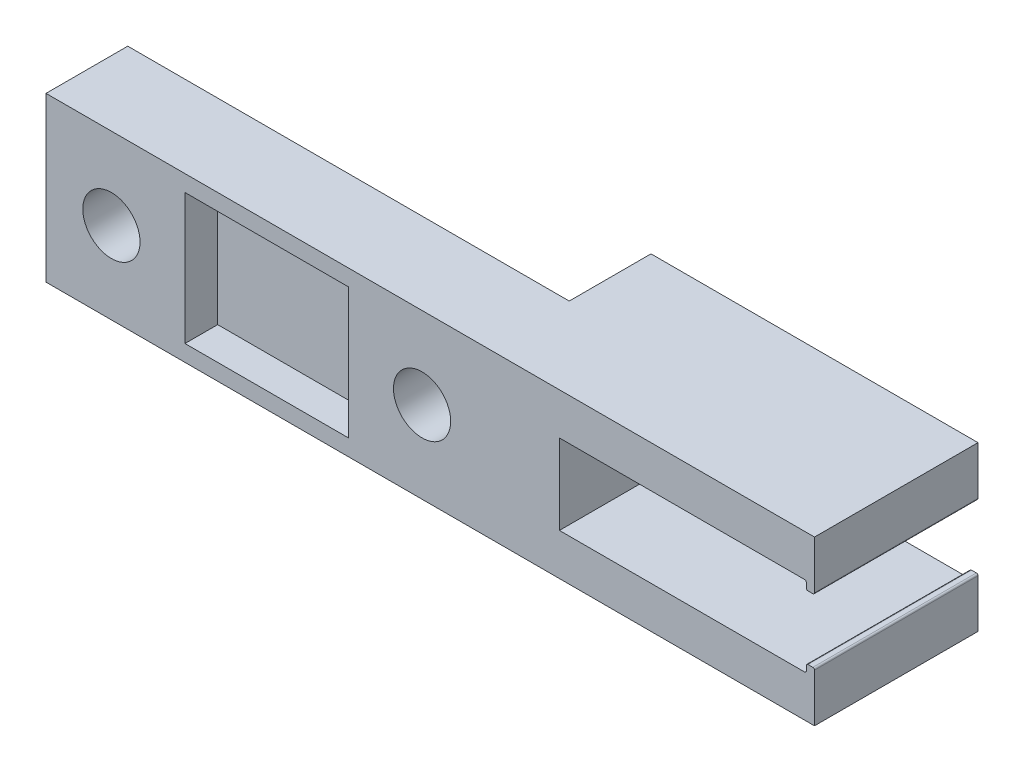
ISO-10303-21;
HEADER;
FILE_DESCRIPTION(('STEP AP214'),'2;1');
FILE_NAME('part.step','',(''),(''),'','','');
FILE_SCHEMA(('AUTOMOTIVE_DESIGN { 1 0 10303 214 1 1 1 1 }'));
ENDSEC;
DATA;
#1=APPLICATION_CONTEXT('core data for automotive mechanical design processes');
#2=APPLICATION_PROTOCOL_DEFINITION('international standard','automotive_design',2000,#1);
#3=PRODUCT_CONTEXT('',#1,'mechanical');
#4=PRODUCT('Part','Part','',(#3));
#5=PRODUCT_RELATED_PRODUCT_CATEGORY('part','',(#4));
#6=PRODUCT_DEFINITION_FORMATION('','',#4);
#7=PRODUCT_DEFINITION_CONTEXT('part definition',#1,'design');
#8=PRODUCT_DEFINITION('design','',#6,#7);
#9=PRODUCT_DEFINITION_SHAPE('','',#8);
#10=(LENGTH_UNIT() NAMED_UNIT(*) SI_UNIT(.MILLI.,.METRE.));
#11=(NAMED_UNIT(*) PLANE_ANGLE_UNIT() SI_UNIT($,.RADIAN.));
#12=(NAMED_UNIT(*) SI_UNIT($,.STERADIAN.) SOLID_ANGLE_UNIT());
#13=UNCERTAINTY_MEASURE_WITH_UNIT(LENGTH_MEASURE(1.E-05),#10,'distance_accuracy_value','');
#14=(GEOMETRIC_REPRESENTATION_CONTEXT(3) GLOBAL_UNCERTAINTY_ASSIGNED_CONTEXT((#13)) GLOBAL_UNIT_ASSIGNED_CONTEXT((#10,
#11,#12)) REPRESENTATION_CONTEXT('',''));
#15=CARTESIAN_POINT('',(0.,0.,0.));
#16=DIRECTION('',(0.,0.,1.));
#17=DIRECTION('',(1.,0.,0.));
#18=AXIS2_PLACEMENT_3D('',#15,#16,#17);
#19=CARTESIAN_POINT('',(0.,-7.45,10.));
#20=DIRECTION('',(0.,1.,0.));
#21=DIRECTION('',(-1.,0.,0.));
#22=AXIS2_PLACEMENT_3D('',#19,#20,#21);
#23=PLANE('',#22);
#24=DIRECTION('',(1.,0.,0.));
#25=VECTOR('',#24,1.);
#26=CARTESIAN_POINT('',(0.,-7.45,10.));
#27=LINE('',#26,#25);
#28=CARTESIAN_POINT('',(4.4,-7.45,10.));
#29=VERTEX_POINT('',#28);
#30=CARTESIAN_POINT('',(19.4,-7.45,10.));
#31=VERTEX_POINT('',#30);
#32=EDGE_CURVE('E279',#29,#31,#27,.T.);
#33=ORIENTED_EDGE('',*,*,#32,.T.);
#34=DIRECTION('',(0.,0.,-1.));
#35=VECTOR('',#34,1.);
#36=CARTESIAN_POINT('',(19.4,-7.45,10.));
#37=LINE('',#36,#35);
#38=CARTESIAN_POINT('',(19.4,-7.45,0.));
#39=VERTEX_POINT('',#38);
#40=EDGE_CURVE('E355',#31,#39,#37,.T.);
#41=ORIENTED_EDGE('',*,*,#40,.T.);
#42=DIRECTION('',(1.,0.,0.));
#43=VECTOR('',#42,1.);
#44=CARTESIAN_POINT('',(0.,-7.45,0.));
#45=LINE('',#44,#43);
#46=CARTESIAN_POINT('',(4.4,-7.45,0.));
#47=VERTEX_POINT('',#46);
#48=EDGE_CURVE('E276',#47,#39,#45,.T.);
#49=ORIENTED_EDGE('',*,*,#48,.F.);
#50=DIRECTION('',(0.,0.,-1.));
#51=VECTOR('',#50,1.);
#52=CARTESIAN_POINT('',(4.4,-7.45,10.));
#53=LINE('',#52,#51);
#54=EDGE_CURVE('E348',#29,#47,#53,.T.);
#55=ORIENTED_EDGE('',*,*,#54,.F.);
#56=EDGE_LOOP('',(#33,#41,#49,#55));
#57=FACE_BOUND('',#56,.T.);
#58=ADVANCED_FACE('F41',(#57),#23,.T.);
#59=CARTESIAN_POINT('',(4.4,0.,10.));
#60=DIRECTION('',(1.,0.,0.));
#61=DIRECTION('',(0.,1.,0.));
#62=AXIS2_PLACEMENT_3D('',#59,#60,#61);
#63=PLANE('',#62);
#64=DIRECTION('',(0.,-1.,0.));
#65=VECTOR('',#64,1.);
#66=CARTESIAN_POINT('',(4.4,0.,0.));
#67=LINE('',#66,#65);
#68=CARTESIAN_POINT('',(4.4,-2.55,0.));
#69=VERTEX_POINT('',#68);
#70=EDGE_CURVE('E310',#69,#47,#67,.T.);
#71=ORIENTED_EDGE('',*,*,#70,.F.);
#72=DIRECTION('',(0.,0.,-1.));
#73=VECTOR('',#72,1.);
#74=CARTESIAN_POINT('',(4.4,-2.55,10.));
#75=LINE('',#74,#73);
#76=CARTESIAN_POINT('',(4.4,-2.55,10.));
#77=VERTEX_POINT('',#76);
#78=EDGE_CURVE('E346',#77,#69,#75,.T.);
#79=ORIENTED_EDGE('',*,*,#78,.F.);
#80=DIRECTION('',(0.,-1.,0.));
#81=VECTOR('',#80,1.);
#82=CARTESIAN_POINT('',(4.4,0.,10.));
#83=LINE('',#82,#81);
#84=EDGE_CURVE('E282',#77,#29,#83,.T.);
#85=ORIENTED_EDGE('',*,*,#84,.T.);
#86=ORIENTED_EDGE('',*,*,#54,.T.);
#87=EDGE_LOOP('',(#71,#79,#85,#86));
#88=FACE_BOUND('',#87,.T.);
#89=ADVANCED_FACE('F463',(#88),#63,.T.);
#90=CARTESIAN_POINT('',(0.,-2.55,10.));
#91=DIRECTION('',(0.,1.,0.));
#92=DIRECTION('',(-1.,0.,0.));
#93=AXIS2_PLACEMENT_3D('',#90,#91,#92);
#94=PLANE('',#93);
#95=DIRECTION('',(1.,0.,0.));
#96=VECTOR('',#95,1.);
#97=CARTESIAN_POINT('',(0.,-2.55,0.));
#98=LINE('',#97,#96);
#99=CARTESIAN_POINT('',(19.4,-2.54999999999999,0.));
#100=VERTEX_POINT('',#99);
#101=EDGE_CURVE('E313',#69,#100,#98,.T.);
#102=ORIENTED_EDGE('',*,*,#101,.T.);
#103=DIRECTION('',(0.,0.,-1.));
#104=VECTOR('',#103,1.);
#105=CARTESIAN_POINT('',(19.4,-2.54999999999999,10.));
#106=LINE('',#105,#104);
#107=CARTESIAN_POINT('',(19.4,-2.54999999999999,10.));
#108=VERTEX_POINT('',#107);
#109=EDGE_CURVE('E353',#100,#108,#106,.F.);
#110=ORIENTED_EDGE('',*,*,#109,.T.);
#111=DIRECTION('',(1.,0.,0.));
#112=VECTOR('',#111,1.);
#113=CARTESIAN_POINT('',(0.,-2.55,10.));
#114=LINE('',#113,#112);
#115=EDGE_CURVE('E286',#77,#108,#114,.T.);
#116=ORIENTED_EDGE('',*,*,#115,.F.);
#117=ORIENTED_EDGE('',*,*,#78,.T.);
#118=EDGE_LOOP('',(#102,#110,#116,#117));
#119=FACE_BOUND('',#118,.T.);
#120=ADVANCED_FACE('F477',(#119),#94,.F.);
#121=CARTESIAN_POINT('',(19.5,0.,10.));
#122=DIRECTION('',(-1.,0.,0.));
#123=DIRECTION('',(0.,0.,1.));
#124=AXIS2_PLACEMENT_3D('',#121,#122,#123);
#125=PLANE('',#124);
#126=DIRECTION('',(0.,1.,0.));
#127=VECTOR('',#126,1.);
#128=CARTESIAN_POINT('',(19.5,0.,0.));
#129=LINE('',#128,#127);
#130=CARTESIAN_POINT('',(19.5,-2.94999999999999,0.));
#131=VERTEX_POINT('',#130);
#132=CARTESIAN_POINT('',(19.5,-2.64999999999999,0.));
#133=VERTEX_POINT('',#132);
#134=EDGE_CURVE('E316',#131,#133,#129,.T.);
#135=ORIENTED_EDGE('',*,*,#134,.F.);
#136=DIRECTION('',(0.,0.,-1.));
#137=VECTOR('',#136,1.);
#138=CARTESIAN_POINT('',(19.5,-2.94999999999999,10.));
#139=LINE('',#138,#137);
#140=CARTESIAN_POINT('',(19.5,-2.94999999999999,10.));
#141=VERTEX_POINT('',#140);
#142=EDGE_CURVE('E11',#131,#141,#139,.F.);
#143=ORIENTED_EDGE('',*,*,#142,.T.);
#144=DIRECTION('',(0.,1.,0.));
#145=VECTOR('',#144,1.);
#146=CARTESIAN_POINT('',(19.5,0.,10.));
#147=LINE('',#146,#145);
#148=CARTESIAN_POINT('',(19.5,-2.64999999999999,10.));
#149=VERTEX_POINT('',#148);
#150=EDGE_CURVE('E289',#141,#149,#147,.T.);
#151=ORIENTED_EDGE('',*,*,#150,.T.);
#152=DIRECTION('',(0.,0.,-1.));
#153=VECTOR('',#152,1.);
#154=CARTESIAN_POINT('',(19.5,-2.64999999999999,10.));
#155=LINE('',#154,#153);
#156=EDGE_CURVE('E350',#149,#133,#155,.T.);
#157=ORIENTED_EDGE('',*,*,#156,.T.);
#158=EDGE_LOOP('',(#135,#143,#151,#157));
#159=FACE_BOUND('',#158,.T.);
#160=ADVANCED_FACE('F474',(#159),#125,.T.);
#161=CARTESIAN_POINT('',(0.,-3.05000000000001,10.));
#162=DIRECTION('',(0.,1.,0.));
#163=DIRECTION('',(-1.,0.,0.));
#164=AXIS2_PLACEMENT_3D('',#161,#162,#163);
#165=PLANE('',#164);
#166=DIRECTION('',(1.,0.,0.));
#167=VECTOR('',#166,1.);
#168=CARTESIAN_POINT('',(0.,-3.05000000000001,0.));
#169=LINE('',#168,#167);
#170=CARTESIAN_POINT('',(19.6,-3.04999999999999,0.));
#171=VERTEX_POINT('',#170);
#172=CARTESIAN_POINT('',(19.9,-3.04999999999999,0.));
#173=VERTEX_POINT('',#172);
#174=EDGE_CURVE('E318',#171,#173,#169,.T.);
#175=ORIENTED_EDGE('',*,*,#174,.T.);
#176=DIRECTION('',(0.,0.,-1.));
#177=VECTOR('',#176,1.);
#178=CARTESIAN_POINT('',(19.9,-3.04999999999999,10.));
#179=LINE('',#178,#177);
#180=CARTESIAN_POINT('',(19.9,-3.04999999999999,10.));
#181=VERTEX_POINT('',#180);
#182=EDGE_CURVE('E49',#173,#181,#179,.F.);
#183=ORIENTED_EDGE('',*,*,#182,.T.);
#184=DIRECTION('',(1.,0.,0.));
#185=VECTOR('',#184,1.);
#186=CARTESIAN_POINT('',(0.,-3.05000000000001,10.));
#187=LINE('',#186,#185);
#188=CARTESIAN_POINT('',(19.6,-3.04999999999999,10.));
#189=VERTEX_POINT('',#188);
#190=EDGE_CURVE('E291',#189,#181,#187,.T.);
#191=ORIENTED_EDGE('',*,*,#190,.F.);
#192=DIRECTION('',(0.,0.,-1.));
#193=VECTOR('',#192,1.);
#194=CARTESIAN_POINT('',(19.6,-3.04999999999999,0.));
#195=LINE('',#194,#193);
#196=EDGE_CURVE('E398',#189,#171,#195,.T.);
#197=ORIENTED_EDGE('',*,*,#196,.T.);
#198=EDGE_LOOP('',(#175,#183,#191,#197));
#199=FACE_BOUND('',#198,.T.);
#200=ADVANCED_FACE('F403',(#199),#165,.F.);
#201=CARTESIAN_POINT('',(20.,0.,10.));
#202=DIRECTION('',(1.,0.,0.));
#203=DIRECTION('',(0.,1.,0.));
#204=AXIS2_PLACEMENT_3D('',#201,#202,#203);
#205=PLANE('',#204);
#206=DIRECTION('',(0.,-1.,0.));
#207=VECTOR('',#206,1.);
#208=CARTESIAN_POINT('',(20.,0.,10.));
#209=LINE('',#208,#207);
#210=CARTESIAN_POINT('',(20.,0.,10.));
#211=VERTEX_POINT('',#210);
#212=CARTESIAN_POINT('',(20.,-2.94999999999999,10.));
#213=VERTEX_POINT('',#212);
#214=EDGE_CURVE('E293',#211,#213,#209,.T.);
#215=ORIENTED_EDGE('',*,*,#214,.T.);
#216=DIRECTION('',(0.,0.,-1.));
#217=VECTOR('',#216,1.);
#218=CARTESIAN_POINT('',(20.,-2.94999999999999,0.));
#219=LINE('',#218,#217);
#220=CARTESIAN_POINT('',(20.,-2.94999999999999,0.));
#221=VERTEX_POINT('',#220);
#222=EDGE_CURVE('E395',#213,#221,#219,.T.);
#223=ORIENTED_EDGE('',*,*,#222,.T.);
#224=DIRECTION('',(0.,-1.,0.));
#225=VECTOR('',#224,1.);
#226=CARTESIAN_POINT('',(20.,0.,0.));
#227=LINE('',#226,#225);
#228=CARTESIAN_POINT('',(20.,0.,0.));
#229=VERTEX_POINT('',#228);
#230=EDGE_CURVE('E321',#229,#221,#227,.T.);
#231=ORIENTED_EDGE('',*,*,#230,.F.);
#232=DIRECTION('',(0.,0.,-1.));
#233=VECTOR('',#232,1.);
#234=CARTESIAN_POINT('',(20.,0.,10.));
#235=LINE('',#234,#233);
#236=EDGE_CURVE('E344',#211,#229,#235,.T.);
#237=ORIENTED_EDGE('',*,*,#236,.F.);
#238=EDGE_LOOP('',(#215,#223,#231,#237));
#239=FACE_BOUND('',#238,.T.);
#240=ADVANCED_FACE('F416',(#239),#205,.T.);
#241=CARTESIAN_POINT('',(0.,0.,10.));
#242=DIRECTION('',(0.,1.,0.));
#243=DIRECTION('',(0.,0.,1.));
#244=AXIS2_PLACEMENT_3D('',#241,#242,#243);
#245=PLANE('',#244);
#246=DIRECTION('',(1.,0.,0.));
#247=VECTOR('',#246,1.);
#248=CARTESIAN_POINT('',(0.,0.,0.));
#249=LINE('',#248,#247);
#250=CARTESIAN_POINT('',(0.,0.,0.));
#251=VERTEX_POINT('',#250);
#252=EDGE_CURVE('E324',#251,#229,#249,.T.);
#253=ORIENTED_EDGE('',*,*,#252,.F.);
#254=DIRECTION('',(0.,0.,-1.));
#255=VECTOR('',#254,1.);
#256=CARTESIAN_POINT('',(0.,0.,10.));
#257=LINE('',#256,#255);
#258=CARTESIAN_POINT('',(0.,0.,5.));
#259=VERTEX_POINT('',#258);
#260=EDGE_CURVE('E342',#259,#251,#257,.T.);
#261=ORIENTED_EDGE('',*,*,#260,.F.);
#262=DIRECTION('',(-1.,0.,0.));
#263=VECTOR('',#262,1.);
#264=CARTESIAN_POINT('',(0.,0.,5.));
#265=LINE('',#264,#263);
#266=CARTESIAN_POINT('',(-27.,0.,5.));
#267=VERTEX_POINT('',#266);
#268=EDGE_CURVE('E261',#259,#267,#265,.T.);
#269=ORIENTED_EDGE('',*,*,#268,.T.);
#270=DIRECTION('',(0.,0.,1.));
#271=VECTOR('',#270,1.);
#272=CARTESIAN_POINT('',(-27.,0.,5.));
#273=LINE('',#272,#271);
#274=CARTESIAN_POINT('',(-27.,0.,10.));
#275=VERTEX_POINT('',#274);
#276=EDGE_CURVE('E270',#267,#275,#273,.T.);
#277=ORIENTED_EDGE('',*,*,#276,.T.);
#278=DIRECTION('',(1.,0.,0.));
#279=VECTOR('',#278,1.);
#280=CARTESIAN_POINT('',(0.,0.,10.));
#281=LINE('',#280,#279);
#282=EDGE_CURVE('E295',#275,#211,#281,.T.);
#283=ORIENTED_EDGE('',*,*,#282,.T.);
#284=ORIENTED_EDGE('',*,*,#236,.T.);
#285=EDGE_LOOP('',(#253,#261,#269,#277,#283,#284));
#286=FACE_BOUND('',#285,.T.);
#287=ADVANCED_FACE('F424',(#286),#245,.T.);
#288=CARTESIAN_POINT('',(0.,0.,10.));
#289=DIRECTION('',(1.,0.,0.));
#290=DIRECTION('',(0.,0.,-1.));
#291=AXIS2_PLACEMENT_3D('',#288,#289,#290);
#292=PLANE('',#291);
#293=DIRECTION('',(0.,0.,-1.));
#294=VECTOR('',#293,1.);
#295=CARTESIAN_POINT('',(0.,-10.,10.));
#296=LINE('',#295,#294);
#297=CARTESIAN_POINT('',(0.,-10.,5.));
#298=VERTEX_POINT('',#297);
#299=CARTESIAN_POINT('',(0.,-10.,0.));
#300=VERTEX_POINT('',#299);
#301=EDGE_CURVE('E340',#298,#300,#296,.T.);
#302=ORIENTED_EDGE('',*,*,#301,.F.);
#303=DIRECTION('',(0.,1.,0.));
#304=VECTOR('',#303,1.);
#305=CARTESIAN_POINT('',(0.,0.,5.));
#306=LINE('',#305,#304);
#307=EDGE_CURVE('E258',#298,#259,#306,.T.);
#308=ORIENTED_EDGE('',*,*,#307,.T.);
#309=ORIENTED_EDGE('',*,*,#260,.T.);
#310=DIRECTION('',(0.,-1.,0.));
#311=VECTOR('',#310,1.);
#312=CARTESIAN_POINT('',(0.,0.,0.));
#313=LINE('',#312,#311);
#314=EDGE_CURVE('E328',#251,#300,#313,.T.);
#315=ORIENTED_EDGE('',*,*,#314,.T.);
#316=EDGE_LOOP('',(#302,#308,#309,#315));
#317=FACE_BOUND('',#316,.T.);
#318=ADVANCED_FACE('F725',(#317),#292,.F.);
#319=CARTESIAN_POINT('',(0.,-10.,10.));
#320=DIRECTION('',(0.,1.,0.));
#321=DIRECTION('',(-1.,0.,0.));
#322=AXIS2_PLACEMENT_3D('',#319,#320,#321);
#323=PLANE('',#322);
#324=DIRECTION('',(1.,0.,0.));
#325=VECTOR('',#324,1.);
#326=CARTESIAN_POINT('',(0.,-10.,0.));
#327=LINE('',#326,#325);
#328=CARTESIAN_POINT('',(20.,-10.,0.));
#329=VERTEX_POINT('',#328);
#330=EDGE_CURVE('E331',#300,#329,#327,.T.);
#331=ORIENTED_EDGE('',*,*,#330,.T.);
#332=DIRECTION('',(0.,0.,-1.));
#333=VECTOR('',#332,1.);
#334=CARTESIAN_POINT('',(20.,-10.,10.));
#335=LINE('',#334,#333);
#336=CARTESIAN_POINT('',(20.,-10.,10.));
#337=VERTEX_POINT('',#336);
#338=EDGE_CURVE('E307',#337,#329,#335,.T.);
#339=ORIENTED_EDGE('',*,*,#338,.F.);
#340=DIRECTION('',(1.,0.,0.));
#341=VECTOR('',#340,1.);
#342=CARTESIAN_POINT('',(0.,-10.,10.));
#343=LINE('',#342,#341);
#344=CARTESIAN_POINT('',(-27.,-10.,10.));
#345=VERTEX_POINT('',#344);
#346=EDGE_CURVE('E299',#345,#337,#343,.T.);
#347=ORIENTED_EDGE('',*,*,#346,.F.);
#348=DIRECTION('',(0.,0.,1.));
#349=VECTOR('',#348,1.);
#350=CARTESIAN_POINT('',(-27.,-10.,5.));
#351=LINE('',#350,#349);
#352=CARTESIAN_POINT('',(-27.,-10.,5.));
#353=VERTEX_POINT('',#352);
#354=EDGE_CURVE('E273',#353,#345,#351,.T.);
#355=ORIENTED_EDGE('',*,*,#354,.F.);
#356=DIRECTION('',(1.,0.,0.));
#357=VECTOR('',#356,1.);
#358=CARTESIAN_POINT('',(0.,-10.,5.));
#359=LINE('',#358,#357);
#360=EDGE_CURVE('E267',#353,#298,#359,.T.);
#361=ORIENTED_EDGE('',*,*,#360,.T.);
#362=ORIENTED_EDGE('',*,*,#301,.T.);
#363=EDGE_LOOP('',(#331,#339,#347,#355,#361,#362));
#364=FACE_BOUND('',#363,.T.);
#365=ADVANCED_FACE('F431',(#364),#323,.F.);
#366=CARTESIAN_POINT('',(20.,-7.05,0.));
#367=VERTEX_POINT('',#366);
#368=EDGE_CURVE('E325',#367,#329,#227,.T.);
#369=ORIENTED_EDGE('',*,*,#368,.F.);
#370=DIRECTION('',(0.,0.,-1.));
#371=VECTOR('',#370,1.);
#372=CARTESIAN_POINT('',(20.,-7.05,10.));
#373=LINE('',#372,#371);
#374=CARTESIAN_POINT('',(20.,-7.05,10.));
#375=VERTEX_POINT('',#374);
#376=EDGE_CURVE('E384',#367,#375,#373,.F.);
#377=ORIENTED_EDGE('',*,*,#376,.T.);
#378=EDGE_CURVE('E296',#375,#337,#209,.T.);
#379=ORIENTED_EDGE('',*,*,#378,.T.);
#380=ORIENTED_EDGE('',*,*,#338,.T.);
#381=EDGE_LOOP('',(#369,#377,#379,#380));
#382=FACE_BOUND('',#381,.T.);
#383=ADVANCED_FACE('F567',(#382),#205,.T.);
#384=CARTESIAN_POINT('',(0.,-6.95,10.));
#385=DIRECTION('',(0.,1.,0.));
#386=DIRECTION('',(0.,0.,1.));
#387=AXIS2_PLACEMENT_3D('',#384,#385,#386);
#388=PLANE('',#387);
#389=DIRECTION('',(1.,0.,0.));
#390=VECTOR('',#389,1.);
#391=CARTESIAN_POINT('',(0.,-6.95,10.));
#392=LINE('',#391,#390);
#393=CARTESIAN_POINT('',(19.6,-6.95,10.));
#394=VERTEX_POINT('',#393);
#395=CARTESIAN_POINT('',(19.9,-6.95,10.));
#396=VERTEX_POINT('',#395);
#397=EDGE_CURVE('E302',#394,#396,#392,.T.);
#398=ORIENTED_EDGE('',*,*,#397,.T.);
#399=DIRECTION('',(0.,0.,-1.));
#400=VECTOR('',#399,1.);
#401=CARTESIAN_POINT('',(19.9,-6.95,10.));
#402=LINE('',#401,#400);
#403=CARTESIAN_POINT('',(19.9,-6.95,0.));
#404=VERTEX_POINT('',#403);
#405=EDGE_CURVE('E373',#396,#404,#402,.T.);
#406=ORIENTED_EDGE('',*,*,#405,.T.);
#407=DIRECTION('',(1.,0.,0.));
#408=VECTOR('',#407,1.);
#409=CARTESIAN_POINT('',(0.,-6.95,0.));
#410=LINE('',#409,#408);
#411=CARTESIAN_POINT('',(19.6,-6.95,0.));
#412=VERTEX_POINT('',#411);
#413=EDGE_CURVE('E334',#412,#404,#410,.T.);
#414=ORIENTED_EDGE('',*,*,#413,.F.);
#415=DIRECTION('',(0.,0.,-1.));
#416=VECTOR('',#415,1.);
#417=CARTESIAN_POINT('',(19.6,-6.95,10.));
#418=LINE('',#417,#416);
#419=EDGE_CURVE('E371',#412,#394,#418,.F.);
#420=ORIENTED_EDGE('',*,*,#419,.T.);
#421=EDGE_LOOP('',(#398,#406,#414,#420));
#422=FACE_BOUND('',#421,.T.);
#423=ADVANCED_FACE('F442',(#422),#388,.T.);
#424=CARTESIAN_POINT('',(19.5,0.,10.));
#425=DIRECTION('',(1.,0.,0.));
#426=DIRECTION('',(0.,0.,-1.));
#427=AXIS2_PLACEMENT_3D('',#424,#425,#426);
#428=PLANE('',#427);
#429=DIRECTION('',(0.,-1.,0.));
#430=VECTOR('',#429,1.);
#431=CARTESIAN_POINT('',(19.5,0.,10.));
#432=LINE('',#431,#430);
#433=CARTESIAN_POINT('',(19.5,-7.05,10.));
#434=VERTEX_POINT('',#433);
#435=CARTESIAN_POINT('',(19.5,-7.35,10.));
#436=VERTEX_POINT('',#435);
#437=EDGE_CURVE('E305',#434,#436,#432,.T.);
#438=ORIENTED_EDGE('',*,*,#437,.F.);
#439=DIRECTION('',(0.,0.,-1.));
#440=VECTOR('',#439,1.);
#441=CARTESIAN_POINT('',(19.5,-7.05,0.));
#442=LINE('',#441,#440);
#443=CARTESIAN_POINT('',(19.5,-7.05,0.));
#444=VERTEX_POINT('',#443);
#445=EDGE_CURVE('E392',#434,#444,#442,.T.);
#446=ORIENTED_EDGE('',*,*,#445,.T.);
#447=DIRECTION('',(0.,-1.,0.));
#448=VECTOR('',#447,1.);
#449=CARTESIAN_POINT('',(19.5,0.,0.));
#450=LINE('',#449,#448);
#451=CARTESIAN_POINT('',(19.5,-7.35,0.));
#452=VERTEX_POINT('',#451);
#453=EDGE_CURVE('E283',#444,#452,#450,.T.);
#454=ORIENTED_EDGE('',*,*,#453,.T.);
#455=DIRECTION('',(0.,0.,-1.));
#456=VECTOR('',#455,1.);
#457=CARTESIAN_POINT('',(19.5,-7.35,10.));
#458=LINE('',#457,#456);
#459=EDGE_CURVE('E358',#452,#436,#458,.F.);
#460=ORIENTED_EDGE('',*,*,#459,.T.);
#461=EDGE_LOOP('',(#438,#446,#454,#460));
#462=FACE_BOUND('',#461,.T.);
#463=ADVANCED_FACE('F450',(#462),#428,.F.);
#464=CARTESIAN_POINT('',(0.,0.,10.));
#465=DIRECTION('',(0.,0.,1.));
#466=DIRECTION('',(1.,0.,0.));
#467=AXIS2_PLACEMENT_3D('',#464,#465,#466);
#468=PLANE('',#467);
#469=DIRECTION('',(0.,1.,0.));
#470=VECTOR('',#469,1.);
#471=CARTESIAN_POINT('',(-8.5,-0.999999999999999,10.));
#472=LINE('',#471,#470);
#473=CARTESIAN_POINT('',(-8.5,-9.,10.));
#474=VERTEX_POINT('',#473);
#475=CARTESIAN_POINT('',(-8.5,-0.999999999999999,10.));
#476=VERTEX_POINT('',#475);
#477=EDGE_CURVE('E210',#474,#476,#472,.T.);
#478=ORIENTED_EDGE('',*,*,#477,.F.);
#479=DIRECTION('',(1.,0.,0.));
#480=VECTOR('',#479,1.);
#481=CARTESIAN_POINT('',(-18.5,-9.,10.));
#482=LINE('',#481,#480);
#483=CARTESIAN_POINT('',(-18.5,-9.,10.));
#484=VERTEX_POINT('',#483);
#485=EDGE_CURVE('E227',#484,#474,#482,.T.);
#486=ORIENTED_EDGE('',*,*,#485,.F.);
#487=DIRECTION('',(0.,-1.,0.));
#488=VECTOR('',#487,1.);
#489=CARTESIAN_POINT('',(-18.5,-0.999999999999999,10.));
#490=LINE('',#489,#488);
#491=CARTESIAN_POINT('',(-18.5,-0.999999999999999,10.));
#492=VERTEX_POINT('',#491);
#493=EDGE_CURVE('E230',#492,#484,#490,.T.);
#494=ORIENTED_EDGE('',*,*,#493,.F.);
#495=DIRECTION('',(-1.,0.,0.));
#496=VECTOR('',#495,1.);
#497=CARTESIAN_POINT('',(-18.5,-0.999999999999999,10.));
#498=LINE('',#497,#496);
#499=EDGE_CURVE('E236',#476,#492,#498,.T.);
#500=ORIENTED_EDGE('',*,*,#499,.F.);
#501=EDGE_LOOP('',(#478,#486,#494,#500));
#502=FACE_BOUND('',#501,.T.);
#503=ORIENTED_EDGE('',*,*,#378,.F.);
#504=CARTESIAN_POINT('',(19.9,-7.05,10.));
#505=DIRECTION('',(0.,0.,1.));
#506=DIRECTION('',(1.,0.,0.));
#507=AXIS2_PLACEMENT_3D('',#504,#505,#506);
#508=CIRCLE('',#507,0.1);
#509=EDGE_CURVE('E390',#375,#396,#508,.T.);
#510=ORIENTED_EDGE('',*,*,#509,.T.);
#511=ORIENTED_EDGE('',*,*,#397,.F.);
#512=CARTESIAN_POINT('',(19.6,-7.05,10.));
#513=DIRECTION('',(0.,0.,1.));
#514=DIRECTION('',(1.,0.,0.));
#515=AXIS2_PLACEMENT_3D('',#512,#513,#514);
#516=CIRCLE('',#515,0.1);
#517=EDGE_CURVE('E56',#394,#434,#516,.T.);
#518=ORIENTED_EDGE('',*,*,#517,.T.);
#519=ORIENTED_EDGE('',*,*,#437,.T.);
#520=CARTESIAN_POINT('',(19.4,-7.35,10.));
#521=DIRECTION('',(0.,0.,1.));
#522=DIRECTION('',(1.,0.,0.));
#523=AXIS2_PLACEMENT_3D('',#520,#521,#522);
#524=CIRCLE('',#523,0.1);
#525=EDGE_CURVE('E369',#436,#31,#524,.F.);
#526=ORIENTED_EDGE('',*,*,#525,.T.);
#527=ORIENTED_EDGE('',*,*,#32,.F.);
#528=ORIENTED_EDGE('',*,*,#84,.F.);
#529=ORIENTED_EDGE('',*,*,#115,.T.);
#530=CARTESIAN_POINT('',(19.4,-2.64999999999999,10.));
#531=DIRECTION('',(0.,0.,1.));
#532=DIRECTION('',(1.,0.,0.));
#533=AXIS2_PLACEMENT_3D('',#530,#531,#532);
#534=CIRCLE('',#533,0.1);
#535=EDGE_CURVE('E363',#108,#149,#534,.F.);
#536=ORIENTED_EDGE('',*,*,#535,.T.);
#537=ORIENTED_EDGE('',*,*,#150,.F.);
#538=CARTESIAN_POINT('',(19.6,-2.94999999999999,10.));
#539=DIRECTION('',(0.,0.,1.));
#540=DIRECTION('',(1.,0.,0.));
#541=AXIS2_PLACEMENT_3D('',#538,#539,#540);
#542=CIRCLE('',#541,0.1);
#543=EDGE_CURVE('E386',#141,#189,#542,.T.);
#544=ORIENTED_EDGE('',*,*,#543,.T.);
#545=ORIENTED_EDGE('',*,*,#190,.T.);
#546=CARTESIAN_POINT('',(19.9,-2.94999999999999,10.));
#547=DIRECTION('',(0.,0.,1.));
#548=DIRECTION('',(1.,0.,0.));
#549=AXIS2_PLACEMENT_3D('',#546,#547,#548);
#550=CIRCLE('',#549,0.1);
#551=EDGE_CURVE('E63',#181,#213,#550,.T.);
#552=ORIENTED_EDGE('',*,*,#551,.T.);
#553=ORIENTED_EDGE('',*,*,#214,.F.);
#554=ORIENTED_EDGE('',*,*,#282,.F.);
#555=DIRECTION('',(0.,-1.,0.));
#556=VECTOR('',#555,1.);
#557=CARTESIAN_POINT('',(-27.,0.,10.));
#558=LINE('',#557,#556);
#559=EDGE_CURVE('E255',#275,#345,#558,.T.);
#560=ORIENTED_EDGE('',*,*,#559,.T.);
#561=ORIENTED_EDGE('',*,*,#346,.T.);
#562=EDGE_LOOP('',(#503,#510,#511,#518,#519,#526,#527,#528,#529,#536,#537,#544,#545,#552,#553,
#554,#560,#561));
#563=FACE_BOUND('',#562,.T.);
#564=CARTESIAN_POINT('',(-4.,-5.,10.));
#565=DIRECTION('',(0.,0.,1.));
#566=DIRECTION('',(1.,0.,0.));
#567=AXIS2_PLACEMENT_3D('',#564,#565,#566);
#568=CIRCLE('',#567,1.75);
#569=CARTESIAN_POINT('',(-2.25,-5.,10.));
#570=VERTEX_POINT('',#569);
#571=EDGE_CURVE('E242',#570,#570,#568,.T.);
#572=ORIENTED_EDGE('',*,*,#571,.F.);
#573=EDGE_LOOP('',(#572));
#574=FACE_BOUND('',#573,.T.);
#575=CARTESIAN_POINT('',(-23.,-5.,10.));
#576=DIRECTION('',(0.,0.,1.));
#577=DIRECTION('',(1.,0.,0.));
#578=AXIS2_PLACEMENT_3D('',#575,#576,#577);
#579=CIRCLE('',#578,1.75);
#580=CARTESIAN_POINT('',(-21.25,-5.,10.));
#581=VERTEX_POINT('',#580);
#582=EDGE_CURVE('E249',#581,#581,#579,.T.);
#583=ORIENTED_EDGE('',*,*,#582,.F.);
#584=EDGE_LOOP('',(#583));
#585=FACE_BOUND('',#584,.T.);
#586=ADVANCED_FACE('F408',(#502,#563,#574,#585),#468,.T.);
#587=CARTESIAN_POINT('',(0.,0.,0.));
#588=DIRECTION('',(0.,0.,1.));
#589=DIRECTION('',(1.,0.,0.));
#590=AXIS2_PLACEMENT_3D('',#587,#588,#589);
#591=PLANE('',#590);
#592=ORIENTED_EDGE('',*,*,#413,.T.);
#593=CARTESIAN_POINT('',(19.9,-7.05,0.));
#594=DIRECTION('',(0.,0.,1.));
#595=DIRECTION('',(1.,0.,0.));
#596=AXIS2_PLACEMENT_3D('',#593,#594,#595);
#597=CIRCLE('',#596,0.1);
#598=EDGE_CURVE('E382',#404,#367,#597,.F.);
#599=ORIENTED_EDGE('',*,*,#598,.T.);
#600=ORIENTED_EDGE('',*,*,#368,.T.);
#601=ORIENTED_EDGE('',*,*,#330,.F.);
#602=ORIENTED_EDGE('',*,*,#314,.F.);
#603=ORIENTED_EDGE('',*,*,#252,.T.);
#604=ORIENTED_EDGE('',*,*,#230,.T.);
#605=CARTESIAN_POINT('',(19.9,-2.94999999999999,0.));
#606=DIRECTION('',(0.,0.,1.));
#607=DIRECTION('',(1.,0.,0.));
#608=AXIS2_PLACEMENT_3D('',#605,#606,#607);
#609=CIRCLE('',#608,0.1);
#610=EDGE_CURVE('E378',#221,#173,#609,.F.);
#611=ORIENTED_EDGE('',*,*,#610,.T.);
#612=ORIENTED_EDGE('',*,*,#174,.F.);
#613=CARTESIAN_POINT('',(19.6,-2.94999999999999,0.));
#614=DIRECTION('',(0.,0.,1.));
#615=DIRECTION('',(1.,0.,0.));
#616=AXIS2_PLACEMENT_3D('',#613,#614,#615);
#617=CIRCLE('',#616,0.1);
#618=EDGE_CURVE('E376',#171,#131,#617,.F.);
#619=ORIENTED_EDGE('',*,*,#618,.T.);
#620=ORIENTED_EDGE('',*,*,#134,.T.);
#621=CARTESIAN_POINT('',(19.4,-2.64999999999999,0.));
#622=DIRECTION('',(0.,0.,1.));
#623=DIRECTION('',(1.,0.,0.));
#624=AXIS2_PLACEMENT_3D('',#621,#622,#623);
#625=CIRCLE('',#624,0.1);
#626=EDGE_CURVE('E361',#133,#100,#625,.T.);
#627=ORIENTED_EDGE('',*,*,#626,.T.);
#628=ORIENTED_EDGE('',*,*,#101,.F.);
#629=ORIENTED_EDGE('',*,*,#70,.T.);
#630=ORIENTED_EDGE('',*,*,#48,.T.);
#631=CARTESIAN_POINT('',(19.4,-7.35,0.));
#632=DIRECTION('',(0.,0.,1.));
#633=DIRECTION('',(1.,0.,0.));
#634=AXIS2_PLACEMENT_3D('',#631,#632,#633);
#635=CIRCLE('',#634,0.1);
#636=EDGE_CURVE('E366',#39,#452,#635,.T.);
#637=ORIENTED_EDGE('',*,*,#636,.T.);
#638=ORIENTED_EDGE('',*,*,#453,.F.);
#639=CARTESIAN_POINT('',(19.6,-7.05,0.));
#640=DIRECTION('',(0.,0.,1.));
#641=DIRECTION('',(1.,0.,0.));
#642=AXIS2_PLACEMENT_3D('',#639,#640,#641);
#643=CIRCLE('',#642,0.1);
#644=EDGE_CURVE('E380',#444,#412,#643,.F.);
#645=ORIENTED_EDGE('',*,*,#644,.T.);
#646=EDGE_LOOP('',(#592,#599,#600,#601,#602,#603,#604,#611,#612,#619,#620,#627,#628,#629,#630,
#637,#638,#645));
#647=FACE_BOUND('',#646,.T.);
#648=ADVANCED_FACE('F418',(#647),#591,.F.);
#649=CARTESIAN_POINT('',(-27.,0.,5.));
#650=DIRECTION('',(-1.,0.,0.));
#651=DIRECTION('',(0.,-1.,0.));
#652=AXIS2_PLACEMENT_3D('',#649,#650,#651);
#653=PLANE('',#652);
#654=ORIENTED_EDGE('',*,*,#559,.F.);
#655=ORIENTED_EDGE('',*,*,#276,.F.);
#656=DIRECTION('',(0.,-1.,0.));
#657=VECTOR('',#656,1.);
#658=CARTESIAN_POINT('',(-27.,0.,5.));
#659=LINE('',#658,#657);
#660=EDGE_CURVE('E264',#267,#353,#659,.T.);
#661=ORIENTED_EDGE('',*,*,#660,.T.);
#662=ORIENTED_EDGE('',*,*,#354,.T.);
#663=EDGE_LOOP('',(#654,#655,#661,#662));
#664=FACE_BOUND('',#663,.T.);
#665=ADVANCED_FACE('F428',(#664),#653,.T.);
#666=CARTESIAN_POINT('',(0.,0.,5.));
#667=DIRECTION('',(0.,0.,-1.));
#668=DIRECTION('',(-1.,0.,0.));
#669=AXIS2_PLACEMENT_3D('',#666,#667,#668);
#670=PLANE('',#669);
#671=CARTESIAN_POINT('',(-4.,-5.,5.));
#672=DIRECTION('',(0.,0.,1.));
#673=DIRECTION('',(1.,0.,0.));
#674=AXIS2_PLACEMENT_3D('',#671,#672,#673);
#675=CIRCLE('',#674,1.75);
#676=CARTESIAN_POINT('',(-2.25,-5.,5.));
#677=VERTEX_POINT('',#676);
#678=EDGE_CURVE('E246',#677,#677,#675,.T.);
#679=ORIENTED_EDGE('',*,*,#678,.T.);
#680=EDGE_LOOP('',(#679));
#681=FACE_BOUND('',#680,.T.);
#682=CARTESIAN_POINT('',(-23.,-5.,5.));
#683=DIRECTION('',(0.,0.,1.));
#684=DIRECTION('',(1.,0.,0.));
#685=AXIS2_PLACEMENT_3D('',#682,#683,#684);
#686=CIRCLE('',#685,1.75);
#687=CARTESIAN_POINT('',(-21.25,-5.,5.));
#688=VERTEX_POINT('',#687);
#689=EDGE_CURVE('E252',#688,#688,#686,.T.);
#690=ORIENTED_EDGE('',*,*,#689,.T.);
#691=EDGE_LOOP('',(#690));
#692=FACE_BOUND('',#691,.T.);
#693=ORIENTED_EDGE('',*,*,#307,.F.);
#694=ORIENTED_EDGE('',*,*,#360,.F.);
#695=ORIENTED_EDGE('',*,*,#660,.F.);
#696=ORIENTED_EDGE('',*,*,#268,.F.);
#697=EDGE_LOOP('',(#693,#694,#695,#696));
#698=FACE_BOUND('',#697,.T.);
#699=ADVANCED_FACE('F699',(#681,#692,#698),#670,.T.);
#700=CARTESIAN_POINT('',(-23.,-5.,5.));
#701=DIRECTION('',(0.,0.,1.));
#702=DIRECTION('',(1.,0.,0.));
#703=AXIS2_PLACEMENT_3D('',#700,#701,#702);
#704=CYLINDRICAL_SURFACE('',#703,1.75);
#705=ORIENTED_EDGE('',*,*,#689,.F.);
#706=EDGE_LOOP('',(#705));
#707=FACE_BOUND('',#706,.T.);
#708=ORIENTED_EDGE('',*,*,#582,.T.);
#709=EDGE_LOOP('',(#708));
#710=FACE_BOUND('',#709,.T.);
#711=ADVANCED_FACE('F688',(#707,#710),#704,.F.);
#712=CARTESIAN_POINT('',(-4.,-5.,5.));
#713=DIRECTION('',(0.,0.,1.));
#714=DIRECTION('',(1.,0.,0.));
#715=AXIS2_PLACEMENT_3D('',#712,#713,#714);
#716=CYLINDRICAL_SURFACE('',#715,1.75);
#717=ORIENTED_EDGE('',*,*,#678,.F.);
#718=EDGE_LOOP('',(#717));
#719=FACE_BOUND('',#718,.T.);
#720=ORIENTED_EDGE('',*,*,#571,.T.);
#721=EDGE_LOOP('',(#720));
#722=FACE_BOUND('',#721,.T.);
#723=ADVANCED_FACE('F678',(#719,#722),#716,.F.);
#724=CARTESIAN_POINT('',(-8.5,-0.999999999999999,8.));
#725=DIRECTION('',(1.,0.,0.));
#726=DIRECTION('',(0.,1.,0.));
#727=AXIS2_PLACEMENT_3D('',#724,#725,#726);
#728=PLANE('',#727);
#729=ORIENTED_EDGE('',*,*,#477,.T.);
#730=DIRECTION('',(0.,0.,1.));
#731=VECTOR('',#730,1.);
#732=CARTESIAN_POINT('',(-8.5,-0.999999999999999,8.));
#733=LINE('',#732,#731);
#734=CARTESIAN_POINT('',(-8.5,-0.999999999999999,8.));
#735=VERTEX_POINT('',#734);
#736=EDGE_CURVE('E203',#735,#476,#733,.T.);
#737=ORIENTED_EDGE('',*,*,#736,.F.);
#738=DIRECTION('',(0.,1.,0.));
#739=VECTOR('',#738,1.);
#740=CARTESIAN_POINT('',(-8.5,-0.999999999999999,8.));
#741=LINE('',#740,#739);
#742=CARTESIAN_POINT('',(-8.5,-9.,8.));
#743=VERTEX_POINT('',#742);
#744=EDGE_CURVE('E207',#743,#735,#741,.T.);
#745=ORIENTED_EDGE('',*,*,#744,.F.);
#746=DIRECTION('',(0.,0.,1.));
#747=VECTOR('',#746,1.);
#748=CARTESIAN_POINT('',(-8.5,-9.,8.));
#749=LINE('',#748,#747);
#750=EDGE_CURVE('E240',#743,#474,#749,.T.);
#751=ORIENTED_EDGE('',*,*,#750,.T.);
#752=EDGE_LOOP('',(#729,#737,#745,#751));
#753=FACE_BOUND('',#752,.T.);
#754=ADVANCED_FACE('F205',(#753),#728,.F.);
#755=CARTESIAN_POINT('',(-18.5,-9.,8.));
#756=DIRECTION('',(0.,-1.,0.));
#757=DIRECTION('',(0.,0.,-1.));
#758=AXIS2_PLACEMENT_3D('',#755,#756,#757);
#759=PLANE('',#758);
#760=ORIENTED_EDGE('',*,*,#485,.T.);
#761=ORIENTED_EDGE('',*,*,#750,.F.);
#762=DIRECTION('',(1.,0.,0.));
#763=VECTOR('',#762,1.);
#764=CARTESIAN_POINT('',(-18.5,-9.,8.));
#765=LINE('',#764,#763);
#766=CARTESIAN_POINT('',(-18.5,-9.,8.));
#767=VERTEX_POINT('',#766);
#768=EDGE_CURVE('E215',#767,#743,#765,.T.);
#769=ORIENTED_EDGE('',*,*,#768,.F.);
#770=DIRECTION('',(0.,0.,1.));
#771=VECTOR('',#770,1.);
#772=CARTESIAN_POINT('',(-18.5,-9.,8.));
#773=LINE('',#772,#771);
#774=EDGE_CURVE('E243',#767,#484,#773,.T.);
#775=ORIENTED_EDGE('',*,*,#774,.T.);
#776=EDGE_LOOP('',(#760,#761,#769,#775));
#777=FACE_BOUND('',#776,.T.);
#778=ADVANCED_FACE('F657',(#777),#759,.F.);
#779=CARTESIAN_POINT('',(-18.5,-0.999999999999999,8.));
#780=DIRECTION('',(-1.,0.,0.));
#781=DIRECTION('',(0.,-1.,0.));
#782=AXIS2_PLACEMENT_3D('',#779,#780,#781);
#783=PLANE('',#782);
#784=ORIENTED_EDGE('',*,*,#493,.T.);
#785=ORIENTED_EDGE('',*,*,#774,.F.);
#786=DIRECTION('',(0.,-1.,0.));
#787=VECTOR('',#786,1.);
#788=CARTESIAN_POINT('',(-18.5,-0.999999999999999,8.));
#789=LINE('',#788,#787);
#790=CARTESIAN_POINT('',(-18.5,-0.999999999999999,8.));
#791=VERTEX_POINT('',#790);
#792=EDGE_CURVE('E223',#791,#767,#789,.T.);
#793=ORIENTED_EDGE('',*,*,#792,.F.);
#794=DIRECTION('',(0.,0.,1.));
#795=VECTOR('',#794,1.);
#796=CARTESIAN_POINT('',(-18.5,-0.999999999999999,8.));
#797=LINE('',#796,#795);
#798=EDGE_CURVE('E214',#791,#492,#797,.T.);
#799=ORIENTED_EDGE('',*,*,#798,.T.);
#800=EDGE_LOOP('',(#784,#785,#793,#799));
#801=FACE_BOUND('',#800,.T.);
#802=ADVANCED_FACE('F647',(#801),#783,.F.);
#803=CARTESIAN_POINT('',(-18.5,-0.999999999999999,8.));
#804=DIRECTION('',(0.,1.,0.));
#805=DIRECTION('',(0.,0.,1.));
#806=AXIS2_PLACEMENT_3D('',#803,#804,#805);
#807=PLANE('',#806);
#808=ORIENTED_EDGE('',*,*,#499,.T.);
#809=ORIENTED_EDGE('',*,*,#798,.F.);
#810=DIRECTION('',(-1.,0.,0.));
#811=VECTOR('',#810,1.);
#812=CARTESIAN_POINT('',(-18.5,-0.999999999999999,8.));
#813=LINE('',#812,#811);
#814=EDGE_CURVE('E218',#735,#791,#813,.T.);
#815=ORIENTED_EDGE('',*,*,#814,.F.);
#816=ORIENTED_EDGE('',*,*,#736,.T.);
#817=EDGE_LOOP('',(#808,#809,#815,#816));
#818=FACE_BOUND('',#817,.T.);
#819=ADVANCED_FACE('F219',(#818),#807,.F.);
#820=CARTESIAN_POINT('',(0.,0.,8.));
#821=DIRECTION('',(0.,0.,1.));
#822=DIRECTION('',(1.,0.,0.));
#823=AXIS2_PLACEMENT_3D('',#820,#821,#822);
#824=PLANE('',#823);
#825=ORIENTED_EDGE('',*,*,#744,.T.);
#826=ORIENTED_EDGE('',*,*,#814,.T.);
#827=ORIENTED_EDGE('',*,*,#792,.T.);
#828=ORIENTED_EDGE('',*,*,#768,.T.);
#829=EDGE_LOOP('',(#825,#826,#827,#828));
#830=FACE_BOUND('',#829,.T.);
#831=ADVANCED_FACE('F225',(#830),#824,.T.);
#832=CARTESIAN_POINT('',(19.4,-2.64999999999999,10.));
#833=DIRECTION('',(0.,0.,-1.));
#834=DIRECTION('',(-1.,0.,0.));
#835=AXIS2_PLACEMENT_3D('',#832,#833,#834);
#836=CYLINDRICAL_SURFACE('',#835,0.1);
#837=ORIENTED_EDGE('',*,*,#535,.F.);
#838=ORIENTED_EDGE('',*,*,#109,.F.);
#839=ORIENTED_EDGE('',*,*,#626,.F.);
#840=ORIENTED_EDGE('',*,*,#156,.F.);
#841=EDGE_LOOP('',(#837,#838,#839,#840));
#842=FACE_BOUND('',#841,.T.);
#843=ADVANCED_FACE('F470',(#842),#836,.F.);
#844=CARTESIAN_POINT('',(19.4,-7.35,10.));
#845=DIRECTION('',(0.,0.,-1.));
#846=DIRECTION('',(-1.,0.,0.));
#847=AXIS2_PLACEMENT_3D('',#844,#845,#846);
#848=CYLINDRICAL_SURFACE('',#847,0.1);
#849=ORIENTED_EDGE('',*,*,#525,.F.);
#850=ORIENTED_EDGE('',*,*,#459,.F.);
#851=ORIENTED_EDGE('',*,*,#636,.F.);
#852=ORIENTED_EDGE('',*,*,#40,.F.);
#853=EDGE_LOOP('',(#849,#850,#851,#852));
#854=FACE_BOUND('',#853,.T.);
#855=ADVANCED_FACE('F459',(#854),#848,.F.);
#856=CARTESIAN_POINT('',(19.9,-7.05,10.));
#857=DIRECTION('',(0.,0.,-1.));
#858=DIRECTION('',(-1.,0.,0.));
#859=AXIS2_PLACEMENT_3D('',#856,#857,#858);
#860=CYLINDRICAL_SURFACE('',#859,0.1);
#861=ORIENTED_EDGE('',*,*,#509,.F.);
#862=ORIENTED_EDGE('',*,*,#376,.F.);
#863=ORIENTED_EDGE('',*,*,#598,.F.);
#864=ORIENTED_EDGE('',*,*,#405,.F.);
#865=EDGE_LOOP('',(#861,#862,#863,#864));
#866=FACE_BOUND('',#865,.T.);
#867=ADVANCED_FACE('F439',(#866),#860,.T.);
#868=CARTESIAN_POINT('',(19.6,-7.05,10.));
#869=DIRECTION('',(0.,0.,1.));
#870=DIRECTION('',(1.,0.,0.));
#871=AXIS2_PLACEMENT_3D('',#868,#869,#870);
#872=CYLINDRICAL_SURFACE('',#871,0.1);
#873=ORIENTED_EDGE('',*,*,#517,.F.);
#874=ORIENTED_EDGE('',*,*,#419,.F.);
#875=ORIENTED_EDGE('',*,*,#644,.F.);
#876=ORIENTED_EDGE('',*,*,#445,.F.);
#877=EDGE_LOOP('',(#873,#874,#875,#876));
#878=FACE_BOUND('',#877,.T.);
#879=ADVANCED_FACE('F448',(#878),#872,.T.);
#880=CARTESIAN_POINT('',(19.9,-2.94999999999999,10.));
#881=DIRECTION('',(0.,0.,1.));
#882=DIRECTION('',(1.,0.,0.));
#883=AXIS2_PLACEMENT_3D('',#880,#881,#882);
#884=CYLINDRICAL_SURFACE('',#883,0.1);
#885=ORIENTED_EDGE('',*,*,#551,.F.);
#886=ORIENTED_EDGE('',*,*,#182,.F.);
#887=ORIENTED_EDGE('',*,*,#610,.F.);
#888=ORIENTED_EDGE('',*,*,#222,.F.);
#889=EDGE_LOOP('',(#885,#886,#887,#888));
#890=FACE_BOUND('',#889,.T.);
#891=ADVANCED_FACE('F413',(#890),#884,.T.);
#892=CARTESIAN_POINT('',(19.6,-2.94999999999999,10.));
#893=DIRECTION('',(0.,0.,1.));
#894=DIRECTION('',(1.,0.,0.));
#895=AXIS2_PLACEMENT_3D('',#892,#893,#894);
#896=CYLINDRICAL_SURFACE('',#895,0.1);
#897=ORIENTED_EDGE('',*,*,#543,.F.);
#898=ORIENTED_EDGE('',*,*,#142,.F.);
#899=ORIENTED_EDGE('',*,*,#618,.F.);
#900=ORIENTED_EDGE('',*,*,#196,.F.);
#901=EDGE_LOOP('',(#897,#898,#899,#900));
#902=FACE_BOUND('',#901,.T.);
#903=ADVANCED_FACE('F43',(#902),#896,.T.);
#904=CLOSED_SHELL('',(#58,#89,#120,#160,#200,#240,#287,#318,#365,#383,#423,#463,#586,#648,#665,
#699,#711,#723,#754,#778,#802,#819,#831,#843,#855,#867,#879,#891,#903));
#905=MANIFOLD_SOLID_BREP('B2',#904);
#906=ADVANCED_BREP_SHAPE_REPRESENTATION('',(#18,#905),#14);
#907=SHAPE_DEFINITION_REPRESENTATION(#9,#906);
ENDSEC;
END-ISO-10303-21;
